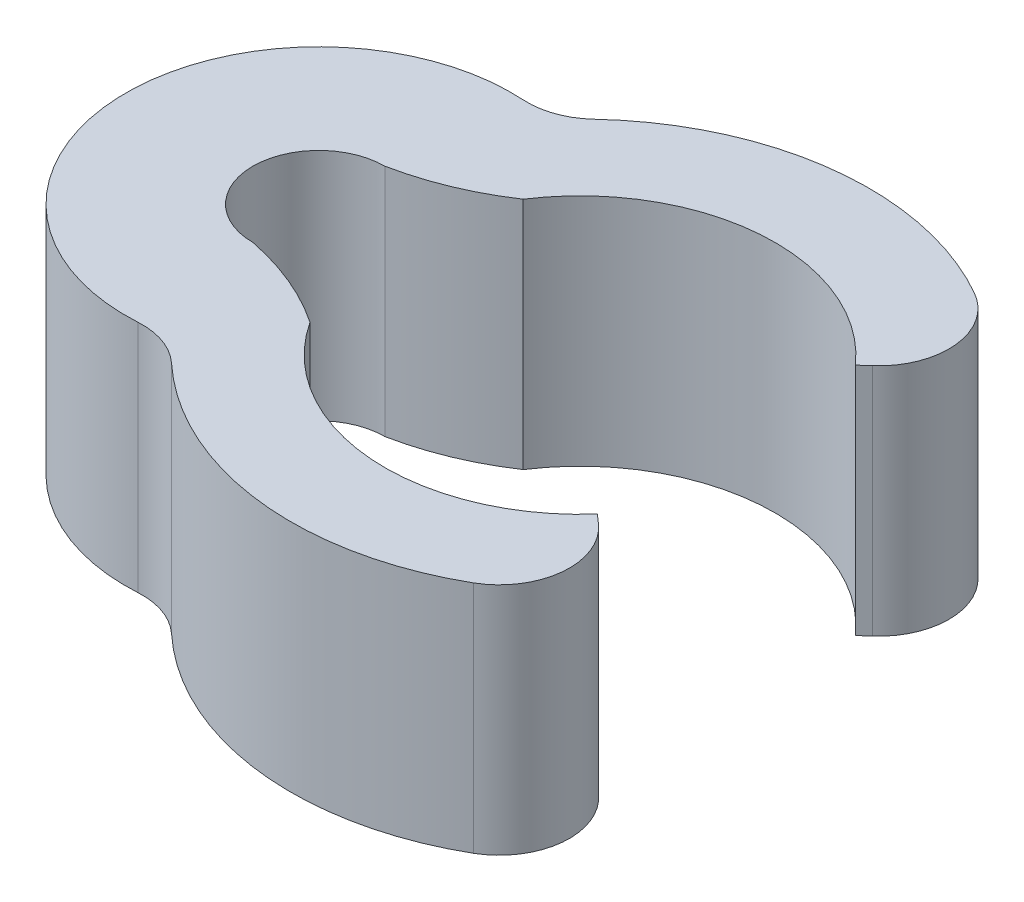
ISO-10303-21;
HEADER;
FILE_DESCRIPTION(('STEP AP214'),'2;1');
FILE_NAME('part.step','',(''),(''),'','','');
FILE_SCHEMA(('AUTOMOTIVE_DESIGN { 1 0 10303 214 1 1 1 1 }'));
ENDSEC;
DATA;
#1=APPLICATION_CONTEXT('core data for automotive mechanical design processes');
#2=APPLICATION_PROTOCOL_DEFINITION('international standard','automotive_design',2000,#1);
#3=PRODUCT_CONTEXT('',#1,'mechanical');
#4=PRODUCT('Part','Part','',(#3));
#5=PRODUCT_RELATED_PRODUCT_CATEGORY('part','',(#4));
#6=PRODUCT_DEFINITION_FORMATION('','',#4);
#7=PRODUCT_DEFINITION_CONTEXT('part definition',#1,'design');
#8=PRODUCT_DEFINITION('design','',#6,#7);
#9=PRODUCT_DEFINITION_SHAPE('','',#8);
#10=(LENGTH_UNIT() NAMED_UNIT(*) SI_UNIT(.MILLI.,.METRE.));
#11=(NAMED_UNIT(*) PLANE_ANGLE_UNIT() SI_UNIT($,.RADIAN.));
#12=(NAMED_UNIT(*) SI_UNIT($,.STERADIAN.) SOLID_ANGLE_UNIT());
#13=UNCERTAINTY_MEASURE_WITH_UNIT(LENGTH_MEASURE(1.E-05),#10,'distance_accuracy_value','');
#14=(GEOMETRIC_REPRESENTATION_CONTEXT(3) GLOBAL_UNCERTAINTY_ASSIGNED_CONTEXT((#13)) GLOBAL_UNIT_ASSIGNED_CONTEXT((#10,
#11,#12)) REPRESENTATION_CONTEXT('',''));
#15=CARTESIAN_POINT('',(0.,0.,0.));
#16=DIRECTION('',(0.,0.,1.));
#17=DIRECTION('',(1.,0.,0.));
#18=AXIS2_PLACEMENT_3D('',#15,#16,#17);
#19=CARTESIAN_POINT('',(-33.9365104632043,10.,-38.5015506309772));
#20=DIRECTION('',(-0.661233228912961,0.,-0.750180389627281));
#21=DIRECTION('',(-0.750180389627281,0.,0.661233228912961));
#22=AXIS2_PLACEMENT_3D('',#19,#20,#21);
#23=PLANE('',#22);
#24=DIRECTION('',(0.750180389627281,0.,-0.661233228912961));
#25=VECTOR('',#24,1.);
#26=CARTESIAN_POINT('',(-33.9365104632043,0.,-38.5015506309772));
#27=LINE('',#26,#25);
#28=CARTESIAN_POINT('',(-59.8252951483657,0.,-15.6823395096271));
#29=VERTEX_POINT('',#28);
#30=CARTESIAN_POINT('',(-59.4384654580238,0.,-16.0233036946696));
#31=VERTEX_POINT('',#30);
#32=EDGE_CURVE('E192',#29,#31,#27,.T.);
#33=ORIENTED_EDGE('',*,*,#32,.T.);
#34=DIRECTION('',(0.,-1.,0.));
#35=VECTOR('',#34,1.);
#36=CARTESIAN_POINT('',(-59.4384654580238,10.,-16.0233036946696));
#37=LINE('',#36,#35);
#38=CARTESIAN_POINT('',(-59.4384654580238,10.,-16.0233036946696));
#39=VERTEX_POINT('',#38);
#40=EDGE_CURVE('E57',#31,#39,#37,.F.);
#41=ORIENTED_EDGE('',*,*,#40,.T.);
#42=DIRECTION('',(0.750180389627281,0.,-0.661233228912961));
#43=VECTOR('',#42,1.);
#44=CARTESIAN_POINT('',(-33.9365104632043,10.,-38.5015506309772));
#45=LINE('',#44,#43);
#46=CARTESIAN_POINT('',(-59.8252951483657,10.,-15.6823395096271));
#47=VERTEX_POINT('',#46);
#48=EDGE_CURVE('E228',#47,#39,#45,.T.);
#49=ORIENTED_EDGE('',*,*,#48,.F.);
#50=DIRECTION('',(0.,-1.,0.));
#51=VECTOR('',#50,1.);
#52=CARTESIAN_POINT('',(-59.8252951483657,10.,-15.6823395096271));
#53=LINE('',#52,#51);
#54=EDGE_CURVE('E191',#47,#29,#53,.T.);
#55=ORIENTED_EDGE('',*,*,#54,.T.);
#56=EDGE_LOOP('',(#33,#41,#49,#55));
#57=FACE_BOUND('',#56,.T.);
#58=ADVANCED_FACE('F41',(#57),#23,.F.);
#59=CARTESIAN_POINT('',(-66.0743830813288,10.,-10.1741915377409));
#60=DIRECTION('',(0.,-1.,0.));
#61=DIRECTION('',(0.,0.,-1.));
#62=AXIS2_PLACEMENT_3D('',#59,#60,#61);
#63=CYLINDRICAL_SURFACE('',#62,12.3406378651365);
#64=CARTESIAN_POINT('',(-66.0743830813288,0.,-10.1741915377409));
#65=DIRECTION('',(0.,1.,0.));
#66=DIRECTION('',(0.,0.,1.));
#67=AXIS2_PLACEMENT_3D('',#64,#65,#66);
#68=CIRCLE('',#67,12.3406378651365);
#69=CARTESIAN_POINT('',(-59.9279787721391,0.,-20.8752689127726));
#70=VERTEX_POINT('',#69);
#71=CARTESIAN_POINT('',(-74.491247564797,0.,-19.1990314357875));
#72=VERTEX_POINT('',#71);
#73=EDGE_CURVE('E195',#70,#72,#68,.T.);
#74=ORIENTED_EDGE('',*,*,#73,.T.);
#75=DIRECTION('',(0.,-1.,0.));
#76=VECTOR('',#75,1.);
#77=CARTESIAN_POINT('',(-74.491247564797,10.,-19.1990314357875));
#78=LINE('',#77,#76);
#79=CARTESIAN_POINT('',(-74.491247564797,10.,-19.1990314357875));
#80=VERTEX_POINT('',#79);
#81=EDGE_CURVE('E259',#72,#80,#78,.F.);
#82=ORIENTED_EDGE('',*,*,#81,.T.);
#83=CARTESIAN_POINT('',(-66.0743830813288,10.,-10.1741915377409));
#84=DIRECTION('',(0.,1.,0.));
#85=DIRECTION('',(0.,0.,1.));
#86=AXIS2_PLACEMENT_3D('',#83,#84,#85);
#87=CIRCLE('',#86,12.3406378651365);
#88=CARTESIAN_POINT('',(-59.9279787721391,10.,-20.8752689127726));
#89=VERTEX_POINT('',#88);
#90=EDGE_CURVE('E299',#89,#80,#87,.T.);
#91=ORIENTED_EDGE('',*,*,#90,.F.);
#92=DIRECTION('',(0.,-1.,0.));
#93=VECTOR('',#92,1.);
#94=CARTESIAN_POINT('',(-59.9279787721391,10.,-20.8752689127726));
#95=LINE('',#94,#93);
#96=EDGE_CURVE('E255',#89,#70,#95,.T.);
#97=ORIENTED_EDGE('',*,*,#96,.T.);
#98=EDGE_LOOP('',(#74,#82,#91,#97));
#99=FACE_BOUND('',#98,.T.);
#100=ADVANCED_FACE('F289',(#99),#63,.T.);
#101=CARTESIAN_POINT('',(-77.2241466086465,10.,-10.1741915377409));
#102=DIRECTION('',(0.,-1.,0.));
#103=DIRECTION('',(0.,0.,-1.));
#104=AXIS2_PLACEMENT_3D('',#101,#102,#103);
#105=CYLINDRICAL_SURFACE('',#104,8.23977262169362);
#106=CARTESIAN_POINT('',(-77.2241466086465,0.,-10.1741915377409));
#107=DIRECTION('',(0.,1.,0.));
#108=DIRECTION('',(0.,0.,1.));
#109=AXIS2_PLACEMENT_3D('',#106,#107,#108);
#110=CIRCLE('',#109,8.23977262169362);
#111=CARTESIAN_POINT('',(-76.7206852386394,0.,-18.3985686877823));
#112=VERTEX_POINT('',#111);
#113=CARTESIAN_POINT('',(-76.7206852386394,0.,-1.94981438769959));
#114=VERTEX_POINT('',#113);
#115=EDGE_CURVE('E199',#112,#114,#110,.T.);
#116=ORIENTED_EDGE('',*,*,#115,.T.);
#117=DIRECTION('',(0.,-1.,0.));
#118=VECTOR('',#117,1.);
#119=CARTESIAN_POINT('',(-76.7206852386394,10.,-1.94981438769959));
#120=LINE('',#119,#118);
#121=CARTESIAN_POINT('',(-76.7206852386394,10.,-1.94981438769959));
#122=VERTEX_POINT('',#121);
#123=EDGE_CURVE('E252',#114,#122,#120,.F.);
#124=ORIENTED_EDGE('',*,*,#123,.T.);
#125=CARTESIAN_POINT('',(-77.2241466086465,10.,-10.1741915377409));
#126=DIRECTION('',(0.,1.,0.));
#127=DIRECTION('',(0.,0.,1.));
#128=AXIS2_PLACEMENT_3D('',#125,#126,#127);
#129=CIRCLE('',#128,8.23977262169362);
#130=CARTESIAN_POINT('',(-76.7206852386394,10.,-18.3985686877823));
#131=VERTEX_POINT('',#130);
#132=EDGE_CURVE('E297',#131,#122,#129,.T.);
#133=ORIENTED_EDGE('',*,*,#132,.F.);
#134=DIRECTION('',(0.,-1.,0.));
#135=VECTOR('',#134,1.);
#136=CARTESIAN_POINT('',(-76.7206852386394,10.,-18.3985686877823));
#137=LINE('',#136,#135);
#138=EDGE_CURVE('E248',#131,#112,#137,.T.);
#139=ORIENTED_EDGE('',*,*,#138,.T.);
#140=EDGE_LOOP('',(#116,#124,#133,#139));
#141=FACE_BOUND('',#140,.T.);
#142=ADVANCED_FACE('F301',(#141),#105,.T.);
#143=CARTESIAN_POINT('',(-66.0743830813288,10.,-10.1741915377409));
#144=DIRECTION('',(0.,-1.,0.));
#145=DIRECTION('',(0.,0.,-1.));
#146=AXIS2_PLACEMENT_3D('',#143,#144,#145);
#147=CYLINDRICAL_SURFACE('',#146,12.3406378651365);
#148=CARTESIAN_POINT('',(-66.0743830813288,10.,-10.1741915377409));
#149=DIRECTION('',(0.,1.,0.));
#150=DIRECTION('',(0.,0.,1.));
#151=AXIS2_PLACEMENT_3D('',#148,#149,#150);
#152=CIRCLE('',#151,12.3406378651365);
#153=CARTESIAN_POINT('',(-74.491247564797,10.,-1.14935163969439));
#154=VERTEX_POINT('',#153);
#155=CARTESIAN_POINT('',(-59.9279787721391,10.,0.526885837290722));
#156=VERTEX_POINT('',#155);
#157=EDGE_CURVE('E170',#154,#156,#152,.T.);
#158=ORIENTED_EDGE('',*,*,#157,.F.);
#159=DIRECTION('',(0.,-1.,0.));
#160=VECTOR('',#159,1.);
#161=CARTESIAN_POINT('',(-74.491247564797,10.,-1.14935163969439));
#162=LINE('',#161,#160);
#163=CARTESIAN_POINT('',(-74.491247564797,0.,-1.14935163969439));
#164=VERTEX_POINT('',#163);
#165=EDGE_CURVE('E244',#154,#164,#162,.T.);
#166=ORIENTED_EDGE('',*,*,#165,.T.);
#167=CARTESIAN_POINT('',(-66.0743830813288,0.,-10.1741915377409));
#168=DIRECTION('',(0.,1.,0.));
#169=DIRECTION('',(0.,0.,1.));
#170=AXIS2_PLACEMENT_3D('',#167,#168,#169);
#171=CIRCLE('',#170,12.3406378651365);
#172=CARTESIAN_POINT('',(-59.9279787721391,0.,0.526885837290722));
#173=VERTEX_POINT('',#172);
#174=EDGE_CURVE('E203',#164,#173,#171,.T.);
#175=ORIENTED_EDGE('',*,*,#174,.T.);
#176=DIRECTION('',(0.,-1.,0.));
#177=VECTOR('',#176,1.);
#178=CARTESIAN_POINT('',(-59.9279787721391,10.,0.526885837290724));
#179=LINE('',#178,#177);
#180=EDGE_CURVE('E157',#173,#156,#179,.F.);
#181=ORIENTED_EDGE('',*,*,#180,.T.);
#182=EDGE_LOOP('',(#158,#166,#175,#181));
#183=FACE_BOUND('',#182,.T.);
#184=ADVANCED_FACE('F383',(#183),#147,.T.);
#185=CARTESIAN_POINT('',(-23.8428130327717,10.,27.0500785330156));
#186=DIRECTION('',(0.661233228912961,0.,-0.750180389627281));
#187=DIRECTION('',(-0.750180389627281,0.,-0.661233228912961));
#188=AXIS2_PLACEMENT_3D('',#185,#186,#187);
#189=PLANE('',#188);
#190=DIRECTION('',(0.750180389627281,0.,0.661233228912961));
#191=VECTOR('',#190,1.);
#192=CARTESIAN_POINT('',(-23.8428130327717,10.,27.0500785330156));
#193=LINE('',#192,#191);
#194=CARTESIAN_POINT('',(-59.8252951483657,10.,-4.66604356585481));
#195=VERTEX_POINT('',#194);
#196=CARTESIAN_POINT('',(-59.4384654580238,10.,-4.32507938081226));
#197=VERTEX_POINT('',#196);
#198=EDGE_CURVE('E148',#195,#197,#193,.T.);
#199=ORIENTED_EDGE('',*,*,#198,.T.);
#200=DIRECTION('',(0.,1.,0.));
#201=VECTOR('',#200,1.);
#202=CARTESIAN_POINT('',(-59.4384654580238,0.,-4.32507938081226));
#203=LINE('',#202,#201);
#204=CARTESIAN_POINT('',(-59.4384654580238,0.,-4.32507938081226));
#205=VERTEX_POINT('',#204);
#206=EDGE_CURVE('E262',#197,#205,#203,.F.);
#207=ORIENTED_EDGE('',*,*,#206,.T.);
#208=DIRECTION('',(0.750180389627281,0.,0.661233228912961));
#209=VECTOR('',#208,1.);
#210=CARTESIAN_POINT('',(-23.8428130327717,0.,27.0500785330156));
#211=LINE('',#210,#209);
#212=CARTESIAN_POINT('',(-59.8252951483657,0.,-4.66604356585481));
#213=VERTEX_POINT('',#212);
#214=EDGE_CURVE('E151',#213,#205,#211,.T.);
#215=ORIENTED_EDGE('',*,*,#214,.F.);
#216=DIRECTION('',(0.,-1.,0.));
#217=VECTOR('',#216,1.);
#218=CARTESIAN_POINT('',(-59.8252951483657,10.,-4.66604356585481));
#219=LINE('',#218,#217);
#220=EDGE_CURVE('E144',#195,#213,#219,.T.);
#221=ORIENTED_EDGE('',*,*,#220,.F.);
#222=EDGE_LOOP('',(#199,#207,#215,#221));
#223=FACE_BOUND('',#222,.T.);
#224=ADVANCED_FACE('F146',(#223),#189,.T.);
#225=CARTESIAN_POINT('',(-66.0743830813288,10.,-10.1741915377409));
#226=DIRECTION('',(0.,-1.,0.));
#227=DIRECTION('',(0.,0.,-1.));
#228=AXIS2_PLACEMENT_3D('',#225,#226,#227);
#229=CYLINDRICAL_SURFACE('',#228,8.33011368914608);
#230=CARTESIAN_POINT('',(-66.0743830813288,0.,-10.1741915377409));
#231=DIRECTION('',(0.,1.,0.));
#232=DIRECTION('',(0.,0.,1.));
#233=AXIS2_PLACEMENT_3D('',#230,#231,#232);
#234=CIRCLE('',#233,8.33011368914608);
#235=CARTESIAN_POINT('',(-73.0512882646116,0.,-5.62297322419222));
#236=VERTEX_POINT('',#235);
#237=EDGE_CURVE('E209',#236,#213,#234,.T.);
#238=ORIENTED_EDGE('',*,*,#237,.F.);
#239=DIRECTION('',(0.,-1.,0.));
#240=VECTOR('',#239,1.);
#241=CARTESIAN_POINT('',(-73.0512882646116,10.,-5.62297322419222));
#242=LINE('',#241,#240);
#243=CARTESIAN_POINT('',(-73.0512882646116,10.,-5.62297322419222));
#244=VERTEX_POINT('',#243);
#245=EDGE_CURVE('E158',#244,#236,#242,.T.);
#246=ORIENTED_EDGE('',*,*,#245,.F.);
#247=CARTESIAN_POINT('',(-66.0743830813288,10.,-10.1741915377409));
#248=DIRECTION('',(0.,1.,0.));
#249=DIRECTION('',(0.,0.,1.));
#250=AXIS2_PLACEMENT_3D('',#247,#248,#249);
#251=CIRCLE('',#250,8.33011368914608);
#252=EDGE_CURVE('E165',#244,#195,#251,.T.);
#253=ORIENTED_EDGE('',*,*,#252,.T.);
#254=ORIENTED_EDGE('',*,*,#220,.T.);
#255=EDGE_LOOP('',(#238,#246,#253,#254));
#256=FACE_BOUND('',#255,.T.);
#257=ADVANCED_FACE('F172',(#256),#229,.F.);
#258=CARTESIAN_POINT('',(-79.477203974212,10.,3.96884953702016));
#259=DIRECTION('',(0.,-1.,0.));
#260=DIRECTION('',(0.,0.,-1.));
#261=AXIS2_PLACEMENT_3D('',#258,#259,#260);
#262=CYLINDRICAL_SURFACE('',#261,11.5453651561742);
#263=CARTESIAN_POINT('',(-79.477203974212,0.,3.96884953702016));
#264=DIRECTION('',(0.,1.,0.));
#265=DIRECTION('',(0.,0.,1.));
#266=AXIS2_PLACEMENT_3D('',#263,#264,#265);
#267=CIRCLE('',#266,11.5453651561742);
#268=CARTESIAN_POINT('',(-77.2241466086465,0.,-7.35454169956936));
#269=VERTEX_POINT('',#268);
#270=EDGE_CURVE('E212',#269,#236,#267,.F.);
#271=ORIENTED_EDGE('',*,*,#270,.F.);
#272=DIRECTION('',(0.,-1.,0.));
#273=VECTOR('',#272,1.);
#274=CARTESIAN_POINT('',(-77.2241466086465,10.,-7.35454169956936));
#275=LINE('',#274,#273);
#276=CARTESIAN_POINT('',(-77.2241466086465,10.,-7.35454169956936));
#277=VERTEX_POINT('',#276);
#278=EDGE_CURVE('E237',#277,#269,#275,.T.);
#279=ORIENTED_EDGE('',*,*,#278,.F.);
#280=CARTESIAN_POINT('',(-79.477203974212,10.,3.96884953702016));
#281=DIRECTION('',(0.,1.,0.));
#282=DIRECTION('',(0.,0.,1.));
#283=AXIS2_PLACEMENT_3D('',#280,#281,#282);
#284=CIRCLE('',#283,11.5453651561742);
#285=EDGE_CURVE('E174',#277,#244,#284,.F.);
#286=ORIENTED_EDGE('',*,*,#285,.T.);
#287=ORIENTED_EDGE('',*,*,#245,.T.);
#288=EDGE_LOOP('',(#271,#279,#286,#287));
#289=FACE_BOUND('',#288,.T.);
#290=ADVANCED_FACE('F440',(#289),#262,.T.);
#291=CARTESIAN_POINT('',(-77.2241466086465,10.,-10.1741915377409));
#292=DIRECTION('',(0.,-1.,0.));
#293=DIRECTION('',(0.,0.,-1.));
#294=AXIS2_PLACEMENT_3D('',#291,#292,#293);
#295=CYLINDRICAL_SURFACE('',#294,2.81964983817158);
#296=CARTESIAN_POINT('',(-77.2241466086465,0.,-10.1741915377409));
#297=DIRECTION('',(0.,1.,0.));
#298=DIRECTION('',(0.,0.,1.));
#299=AXIS2_PLACEMENT_3D('',#296,#297,#298);
#300=CIRCLE('',#299,2.81964983817158);
#301=CARTESIAN_POINT('',(-77.2241466086465,0.,-12.9938413759125));
#302=VERTEX_POINT('',#301);
#303=EDGE_CURVE('E216',#302,#269,#300,.T.);
#304=ORIENTED_EDGE('',*,*,#303,.F.);
#305=DIRECTION('',(0.,-1.,0.));
#306=VECTOR('',#305,1.);
#307=CARTESIAN_POINT('',(-77.2241466086465,10.,-12.9938413759125));
#308=LINE('',#307,#306);
#309=CARTESIAN_POINT('',(-77.2241466086465,10.,-12.9938413759125));
#310=VERTEX_POINT('',#309);
#311=EDGE_CURVE('E234',#310,#302,#308,.T.);
#312=ORIENTED_EDGE('',*,*,#311,.F.);
#313=CARTESIAN_POINT('',(-77.2241466086465,10.,-10.1741915377409));
#314=DIRECTION('',(0.,1.,0.));
#315=DIRECTION('',(0.,0.,1.));
#316=AXIS2_PLACEMENT_3D('',#313,#314,#315);
#317=CIRCLE('',#316,2.81964983817158);
#318=EDGE_CURVE('E177',#310,#277,#317,.T.);
#319=ORIENTED_EDGE('',*,*,#318,.T.);
#320=ORIENTED_EDGE('',*,*,#278,.T.);
#321=EDGE_LOOP('',(#304,#312,#319,#320));
#322=FACE_BOUND('',#321,.T.);
#323=ADVANCED_FACE('F430',(#322),#295,.F.);
#324=CARTESIAN_POINT('',(-79.477203974212,10.,-24.317232612502));
#325=DIRECTION('',(0.,-1.,0.));
#326=DIRECTION('',(0.,0.,-1.));
#327=AXIS2_PLACEMENT_3D('',#324,#325,#326);
#328=CYLINDRICAL_SURFACE('',#327,11.5453651561742);
#329=CARTESIAN_POINT('',(-79.477203974212,0.,-24.317232612502));
#330=DIRECTION('',(0.,1.,0.));
#331=DIRECTION('',(0.,0.,1.));
#332=AXIS2_PLACEMENT_3D('',#329,#330,#331);
#333=CIRCLE('',#332,11.5453651561742);
#334=CARTESIAN_POINT('',(-73.0512882646116,0.,-14.7254098512897));
#335=VERTEX_POINT('',#334);
#336=EDGE_CURVE('E220',#302,#335,#333,.T.);
#337=ORIENTED_EDGE('',*,*,#336,.T.);
#338=DIRECTION('',(0.,-1.,0.));
#339=VECTOR('',#338,1.);
#340=CARTESIAN_POINT('',(-73.0512882646116,10.,-14.7254098512897));
#341=LINE('',#340,#339);
#342=CARTESIAN_POINT('',(-73.0512882646116,10.,-14.7254098512897));
#343=VERTEX_POINT('',#342);
#344=EDGE_CURVE('E231',#343,#335,#341,.T.);
#345=ORIENTED_EDGE('',*,*,#344,.F.);
#346=CARTESIAN_POINT('',(-79.477203974212,10.,-24.317232612502));
#347=DIRECTION('',(0.,1.,0.));
#348=DIRECTION('',(0.,0.,1.));
#349=AXIS2_PLACEMENT_3D('',#346,#347,#348);
#350=CIRCLE('',#349,11.5453651561742);
#351=EDGE_CURVE('E184',#310,#343,#350,.T.);
#352=ORIENTED_EDGE('',*,*,#351,.F.);
#353=ORIENTED_EDGE('',*,*,#311,.T.);
#354=EDGE_LOOP('',(#337,#345,#352,#353));
#355=FACE_BOUND('',#354,.T.);
#356=ADVANCED_FACE('F419',(#355),#328,.T.);
#357=CARTESIAN_POINT('',(-66.0743830813288,10.,-10.1741915377409));
#358=DIRECTION('',(0.,-1.,0.));
#359=DIRECTION('',(0.,0.,-1.));
#360=AXIS2_PLACEMENT_3D('',#357,#358,#359);
#361=CYLINDRICAL_SURFACE('',#360,8.33011368914608);
#362=CARTESIAN_POINT('',(-66.0743830813288,0.,-10.1741915377409));
#363=DIRECTION('',(0.,1.,0.));
#364=DIRECTION('',(0.,0.,1.));
#365=AXIS2_PLACEMENT_3D('',#362,#363,#364);
#366=CIRCLE('',#365,8.33011368914608);
#367=EDGE_CURVE('E224',#29,#335,#366,.T.);
#368=ORIENTED_EDGE('',*,*,#367,.F.);
#369=ORIENTED_EDGE('',*,*,#54,.F.);
#370=CARTESIAN_POINT('',(-66.0743830813288,10.,-10.1741915377409));
#371=DIRECTION('',(0.,1.,0.));
#372=DIRECTION('',(0.,0.,1.));
#373=AXIS2_PLACEMENT_3D('',#370,#371,#372);
#374=CIRCLE('',#373,8.33011368914608);
#375=EDGE_CURVE('E187',#47,#343,#374,.T.);
#376=ORIENTED_EDGE('',*,*,#375,.T.);
#377=ORIENTED_EDGE('',*,*,#344,.T.);
#378=EDGE_LOOP('',(#368,#369,#376,#377));
#379=FACE_BOUND('',#378,.T.);
#380=ADVANCED_FACE('F371',(#379),#361,.F.);
#381=CARTESIAN_POINT('',(0.,10.,0.));
#382=DIRECTION('',(0.,1.,0.));
#383=DIRECTION('',(0.,0.,1.));
#384=AXIS2_PLACEMENT_3D('',#381,#382,#383);
#385=PLANE('',#384);
#386=ORIENTED_EDGE('',*,*,#157,.T.);
#387=CARTESIAN_POINT('',(-61.4221651447626,10.,-2.07453821193041));
#388=DIRECTION('',(0.,1.,0.));
#389=DIRECTION('',(0.,0.,1.));
#390=AXIS2_PLACEMENT_3D('',#387,#388,#389);
#391=CIRCLE('',#390,3.);
#392=EDGE_CURVE('E168',#156,#197,#391,.T.);
#393=ORIENTED_EDGE('',*,*,#392,.T.);
#394=ORIENTED_EDGE('',*,*,#198,.F.);
#395=ORIENTED_EDGE('',*,*,#252,.F.);
#396=ORIENTED_EDGE('',*,*,#285,.F.);
#397=ORIENTED_EDGE('',*,*,#318,.F.);
#398=ORIENTED_EDGE('',*,*,#351,.T.);
#399=ORIENTED_EDGE('',*,*,#375,.F.);
#400=ORIENTED_EDGE('',*,*,#48,.T.);
#401=CARTESIAN_POINT('',(-61.4221651447626,10.,-18.2738448635515));
#402=DIRECTION('',(0.,1.,0.));
#403=DIRECTION('',(0.,0.,1.));
#404=AXIS2_PLACEMENT_3D('',#401,#402,#403);
#405=CIRCLE('',#404,3.);
#406=EDGE_CURVE('E270',#39,#89,#405,.T.);
#407=ORIENTED_EDGE('',*,*,#406,.T.);
#408=ORIENTED_EDGE('',*,*,#90,.T.);
#409=CARTESIAN_POINT('',(-76.5373811379844,10.,-21.3929633856608));
#410=DIRECTION('',(0.,1.,0.));
#411=DIRECTION('',(0.,0.,1.));
#412=AXIS2_PLACEMENT_3D('',#409,#410,#411);
#413=CIRCLE('',#412,3.);
#414=EDGE_CURVE('E11',#80,#131,#413,.F.);
#415=ORIENTED_EDGE('',*,*,#414,.T.);
#416=ORIENTED_EDGE('',*,*,#132,.T.);
#417=CARTESIAN_POINT('',(-76.5373811379844,10.,1.04458031017894));
#418=DIRECTION('',(0.,1.,0.));
#419=DIRECTION('',(0.,0.,1.));
#420=AXIS2_PLACEMENT_3D('',#417,#418,#419);
#421=CIRCLE('',#420,3.);
#422=EDGE_CURVE('E280',#122,#154,#421,.F.);
#423=ORIENTED_EDGE('',*,*,#422,.T.);
#424=EDGE_LOOP('',(#386,#393,#394,#395,#396,#397,#398,#399,#400,#407,#408,#415,#416,#423));
#425=FACE_BOUND('',#424,.T.);
#426=ADVANCED_FACE('F163',(#425),#385,.T.);
#427=CARTESIAN_POINT('',(0.,0.,0.));
#428=DIRECTION('',(0.,1.,0.));
#429=DIRECTION('',(0.,0.,1.));
#430=AXIS2_PLACEMENT_3D('',#427,#428,#429);
#431=PLANE('',#430);
#432=ORIENTED_EDGE('',*,*,#214,.T.);
#433=CARTESIAN_POINT('',(-61.4221651447626,0.,-2.07453821193041));
#434=DIRECTION('',(0.,1.,0.));
#435=DIRECTION('',(0.,0.,1.));
#436=AXIS2_PLACEMENT_3D('',#433,#434,#435);
#437=CIRCLE('',#436,3.);
#438=EDGE_CURVE('E267',#205,#173,#437,.F.);
#439=ORIENTED_EDGE('',*,*,#438,.T.);
#440=ORIENTED_EDGE('',*,*,#174,.F.);
#441=CARTESIAN_POINT('',(-76.5373811379844,0.,1.04458031017894));
#442=DIRECTION('',(0.,1.,0.));
#443=DIRECTION('',(0.,0.,1.));
#444=AXIS2_PLACEMENT_3D('',#441,#442,#443);
#445=CIRCLE('',#444,3.);
#446=EDGE_CURVE('E277',#164,#114,#445,.T.);
#447=ORIENTED_EDGE('',*,*,#446,.T.);
#448=ORIENTED_EDGE('',*,*,#115,.F.);
#449=CARTESIAN_POINT('',(-76.5373811379844,0.,-21.3929633856608));
#450=DIRECTION('',(0.,1.,0.));
#451=DIRECTION('',(0.,0.,1.));
#452=AXIS2_PLACEMENT_3D('',#449,#450,#451);
#453=CIRCLE('',#452,3.);
#454=EDGE_CURVE('E50',#112,#72,#453,.T.);
#455=ORIENTED_EDGE('',*,*,#454,.T.);
#456=ORIENTED_EDGE('',*,*,#73,.F.);
#457=CARTESIAN_POINT('',(-61.4221651447626,0.,-18.2738448635515));
#458=DIRECTION('',(0.,1.,0.));
#459=DIRECTION('',(0.,0.,1.));
#460=AXIS2_PLACEMENT_3D('',#457,#458,#459);
#461=CIRCLE('',#460,3.);
#462=EDGE_CURVE('E65',#70,#31,#461,.F.);
#463=ORIENTED_EDGE('',*,*,#462,.T.);
#464=ORIENTED_EDGE('',*,*,#32,.F.);
#465=ORIENTED_EDGE('',*,*,#367,.T.);
#466=ORIENTED_EDGE('',*,*,#336,.F.);
#467=ORIENTED_EDGE('',*,*,#303,.T.);
#468=ORIENTED_EDGE('',*,*,#270,.T.);
#469=ORIENTED_EDGE('',*,*,#237,.T.);
#470=EDGE_LOOP('',(#432,#439,#440,#447,#448,#455,#456,#463,#464,#465,#466,#467,#468,#469));
#471=FACE_BOUND('',#470,.T.);
#472=ADVANCED_FACE('F284',(#471),#431,.F.);
#473=CARTESIAN_POINT('',(-76.5373811379844,10.,1.04458031017894));
#474=DIRECTION('',(0.,1.,0.));
#475=DIRECTION('',(0.,0.,1.));
#476=AXIS2_PLACEMENT_3D('',#473,#474,#475);
#477=CYLINDRICAL_SURFACE('',#476,3.);
#478=ORIENTED_EDGE('',*,*,#422,.F.);
#479=ORIENTED_EDGE('',*,*,#123,.F.);
#480=ORIENTED_EDGE('',*,*,#446,.F.);
#481=ORIENTED_EDGE('',*,*,#165,.F.);
#482=EDGE_LOOP('',(#478,#479,#480,#481));
#483=FACE_BOUND('',#482,.T.);
#484=ADVANCED_FACE('F327',(#483),#477,.F.);
#485=CARTESIAN_POINT('',(-76.5373811379844,10.,-21.3929633856608));
#486=DIRECTION('',(0.,1.,0.));
#487=DIRECTION('',(0.,0.,1.));
#488=AXIS2_PLACEMENT_3D('',#485,#486,#487);
#489=CYLINDRICAL_SURFACE('',#488,3.);
#490=ORIENTED_EDGE('',*,*,#414,.F.);
#491=ORIENTED_EDGE('',*,*,#81,.F.);
#492=ORIENTED_EDGE('',*,*,#454,.F.);
#493=ORIENTED_EDGE('',*,*,#138,.F.);
#494=EDGE_LOOP('',(#490,#491,#492,#493));
#495=FACE_BOUND('',#494,.T.);
#496=ADVANCED_FACE('F294',(#495),#489,.F.);
#497=CARTESIAN_POINT('',(-61.4221651447626,10.,-2.07453821193041));
#498=DIRECTION('',(0.,-1.,0.));
#499=DIRECTION('',(0.,0.,-1.));
#500=AXIS2_PLACEMENT_3D('',#497,#498,#499);
#501=CYLINDRICAL_SURFACE('',#500,3.);
#502=ORIENTED_EDGE('',*,*,#392,.F.);
#503=ORIENTED_EDGE('',*,*,#180,.F.);
#504=ORIENTED_EDGE('',*,*,#438,.F.);
#505=ORIENTED_EDGE('',*,*,#206,.F.);
#506=EDGE_LOOP('',(#502,#503,#504,#505));
#507=FACE_BOUND('',#506,.T.);
#508=ADVANCED_FACE('F314',(#507),#501,.T.);
#509=CARTESIAN_POINT('',(-61.4221651447626,10.,-18.2738448635515));
#510=DIRECTION('',(0.,-1.,0.));
#511=DIRECTION('',(0.,0.,-1.));
#512=AXIS2_PLACEMENT_3D('',#509,#510,#511);
#513=CYLINDRICAL_SURFACE('',#512,3.);
#514=ORIENTED_EDGE('',*,*,#406,.F.);
#515=ORIENTED_EDGE('',*,*,#40,.F.);
#516=ORIENTED_EDGE('',*,*,#462,.F.);
#517=ORIENTED_EDGE('',*,*,#96,.F.);
#518=EDGE_LOOP('',(#514,#515,#516,#517));
#519=FACE_BOUND('',#518,.T.);
#520=ADVANCED_FACE('F43',(#519),#513,.T.);
#521=CLOSED_SHELL('',(#58,#100,#142,#184,#224,#257,#290,#323,#356,#380,#426,#472,#484,#496,#508,#520));
#522=MANIFOLD_SOLID_BREP('B2',#521);
#523=ADVANCED_BREP_SHAPE_REPRESENTATION('',(#18,#522),#14);
#524=SHAPE_DEFINITION_REPRESENTATION(#9,#523);
ENDSEC;
END-ISO-10303-21;
